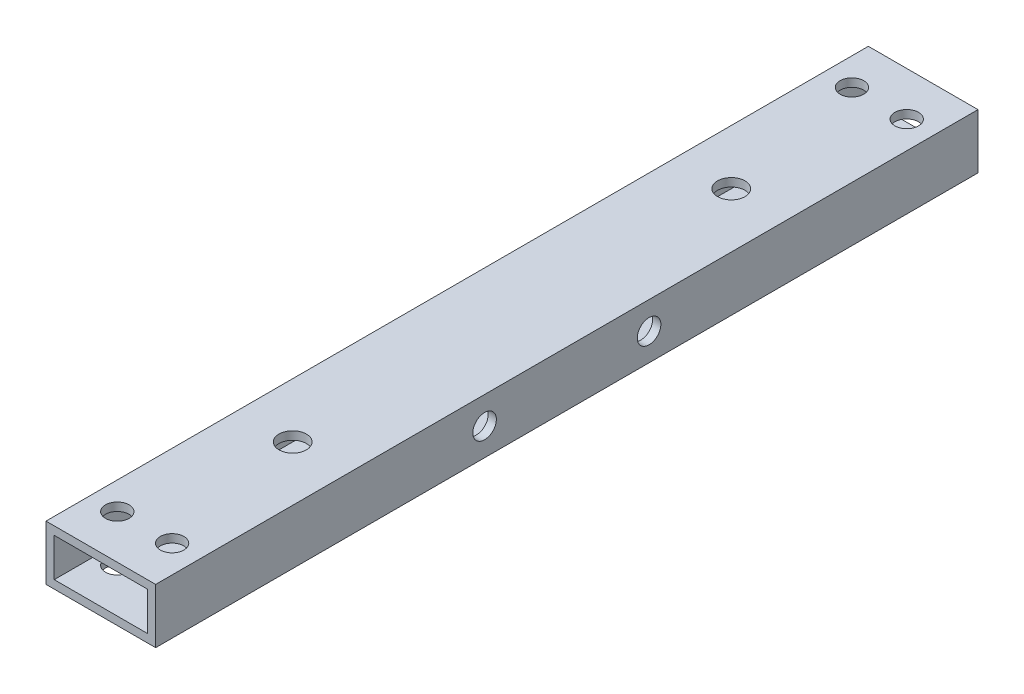
ISO-10303-21;
HEADER;
FILE_DESCRIPTION(('STEP AP214'),'2;1');
FILE_NAME('part.step','',(''),(''),'','','');
FILE_SCHEMA(('AUTOMOTIVE_DESIGN { 1 0 10303 214 1 1 1 1 }'));
ENDSEC;
DATA;
#1=APPLICATION_CONTEXT('core data for automotive mechanical design processes');
#2=APPLICATION_PROTOCOL_DEFINITION('international standard','automotive_design',2000,#1);
#3=PRODUCT_CONTEXT('',#1,'mechanical');
#4=PRODUCT('Part','Part','',(#3));
#5=PRODUCT_RELATED_PRODUCT_CATEGORY('part','',(#4));
#6=PRODUCT_DEFINITION_FORMATION('','',#4);
#7=PRODUCT_DEFINITION_CONTEXT('part definition',#1,'design');
#8=PRODUCT_DEFINITION('design','',#6,#7);
#9=PRODUCT_DEFINITION_SHAPE('','',#8);
#10=(LENGTH_UNIT() NAMED_UNIT(*) SI_UNIT(.MILLI.,.METRE.));
#11=(NAMED_UNIT(*) PLANE_ANGLE_UNIT() SI_UNIT($,.RADIAN.));
#12=(NAMED_UNIT(*) SI_UNIT($,.STERADIAN.) SOLID_ANGLE_UNIT());
#13=UNCERTAINTY_MEASURE_WITH_UNIT(LENGTH_MEASURE(1.E-05),#10,'distance_accuracy_value','');
#14=(GEOMETRIC_REPRESENTATION_CONTEXT(3) GLOBAL_UNCERTAINTY_ASSIGNED_CONTEXT((#13)) GLOBAL_UNIT_ASSIGNED_CONTEXT((#10,
#11,#12)) REPRESENTATION_CONTEXT('',''));
#15=CARTESIAN_POINT('',(0.,0.,0.));
#16=DIRECTION('',(0.,0.,1.));
#17=DIRECTION('',(1.,0.,0.));
#18=AXIS2_PLACEMENT_3D('',#15,#16,#17);
#19=CARTESIAN_POINT('',(0.,0.,150.));
#20=DIRECTION('',(0.,0.,1.));
#21=DIRECTION('',(1.,0.,0.));
#22=AXIS2_PLACEMENT_3D('',#19,#20,#21);
#23=PLANE('',#22);
#24=DIRECTION('',(0.,1.,0.));
#25=VECTOR('',#24,1.);
#26=CARTESIAN_POINT('',(10.,5.,150.));
#27=LINE('',#26,#25);
#28=CARTESIAN_POINT('',(10.,-5.,150.));
#29=VERTEX_POINT('',#28);
#30=CARTESIAN_POINT('',(10.,5.,150.));
#31=VERTEX_POINT('',#30);
#32=EDGE_CURVE('E164',#29,#31,#27,.T.);
#33=ORIENTED_EDGE('',*,*,#32,.T.);
#34=DIRECTION('',(-1.,0.,0.));
#35=VECTOR('',#34,1.);
#36=CARTESIAN_POINT('',(-10.,5.,150.));
#37=LINE('',#36,#35);
#38=CARTESIAN_POINT('',(-10.,5.,150.));
#39=VERTEX_POINT('',#38);
#40=EDGE_CURVE('E167',#31,#39,#37,.T.);
#41=ORIENTED_EDGE('',*,*,#40,.T.);
#42=DIRECTION('',(0.,-1.,0.));
#43=VECTOR('',#42,1.);
#44=CARTESIAN_POINT('',(-10.,5.,150.));
#45=LINE('',#44,#43);
#46=CARTESIAN_POINT('',(-10.,-5.,150.));
#47=VERTEX_POINT('',#46);
#48=EDGE_CURVE('E170',#39,#47,#45,.T.);
#49=ORIENTED_EDGE('',*,*,#48,.T.);
#50=DIRECTION('',(1.,0.,0.));
#51=VECTOR('',#50,1.);
#52=CARTESIAN_POINT('',(-10.,-5.,150.));
#53=LINE('',#52,#51);
#54=EDGE_CURVE('E172',#47,#29,#53,.T.);
#55=ORIENTED_EDGE('',*,*,#54,.T.);
#56=EDGE_LOOP('',(#33,#41,#49,#55));
#57=FACE_BOUND('',#56,.T.);
#58=DIRECTION('',(-1.,0.,0.));
#59=VECTOR('',#58,1.);
#60=CARTESIAN_POINT('',(-10.,3.5,150.));
#61=LINE('',#60,#59);
#62=CARTESIAN_POINT('',(8.5,3.5,150.));
#63=VERTEX_POINT('',#62);
#64=CARTESIAN_POINT('',(-8.5,3.5,150.));
#65=VERTEX_POINT('',#64);
#66=EDGE_CURVE('E134',#63,#65,#61,.T.);
#67=ORIENTED_EDGE('',*,*,#66,.F.);
#68=DIRECTION('',(0.,1.,0.));
#69=VECTOR('',#68,1.);
#70=CARTESIAN_POINT('',(8.5,5.,150.));
#71=LINE('',#70,#69);
#72=CARTESIAN_POINT('',(8.5,-3.5,150.));
#73=VERTEX_POINT('',#72);
#74=EDGE_CURVE('E126',#73,#63,#71,.T.);
#75=ORIENTED_EDGE('',*,*,#74,.F.);
#76=DIRECTION('',(1.,0.,0.));
#77=VECTOR('',#76,1.);
#78=CARTESIAN_POINT('',(-10.,-3.5,150.));
#79=LINE('',#78,#77);
#80=CARTESIAN_POINT('',(-8.5,-3.5,150.));
#81=VERTEX_POINT('',#80);
#82=EDGE_CURVE('E148',#81,#73,#79,.T.);
#83=ORIENTED_EDGE('',*,*,#82,.F.);
#84=DIRECTION('',(0.,-1.,0.));
#85=VECTOR('',#84,1.);
#86=CARTESIAN_POINT('',(-8.5,5.,150.));
#87=LINE('',#86,#85);
#88=EDGE_CURVE('E146',#65,#81,#87,.T.);
#89=ORIENTED_EDGE('',*,*,#88,.F.);
#90=EDGE_LOOP('',(#67,#75,#83,#89));
#91=FACE_BOUND('',#90,.T.);
#92=ADVANCED_FACE('F59',(#57,#91),#23,.T.);
#93=CARTESIAN_POINT('',(0.,0.,0.));
#94=DIRECTION('',(0.,0.,1.));
#95=DIRECTION('',(1.,0.,0.));
#96=AXIS2_PLACEMENT_3D('',#93,#94,#95);
#97=PLANE('',#96);
#98=DIRECTION('',(0.,1.,0.));
#99=VECTOR('',#98,1.);
#100=CARTESIAN_POINT('',(10.,5.,0.));
#101=LINE('',#100,#99);
#102=CARTESIAN_POINT('',(10.,-5.,0.));
#103=VERTEX_POINT('',#102);
#104=CARTESIAN_POINT('',(10.,5.,0.));
#105=VERTEX_POINT('',#104);
#106=EDGE_CURVE('E142',#103,#105,#101,.T.);
#107=ORIENTED_EDGE('',*,*,#106,.F.);
#108=DIRECTION('',(1.,0.,0.));
#109=VECTOR('',#108,1.);
#110=CARTESIAN_POINT('',(-10.,-5.,0.));
#111=LINE('',#110,#109);
#112=CARTESIAN_POINT('',(-10.,-5.,0.));
#113=VERTEX_POINT('',#112);
#114=EDGE_CURVE('E168',#113,#103,#111,.T.);
#115=ORIENTED_EDGE('',*,*,#114,.F.);
#116=DIRECTION('',(0.,-1.,0.));
#117=VECTOR('',#116,1.);
#118=CARTESIAN_POINT('',(-10.,5.,0.));
#119=LINE('',#118,#117);
#120=CARTESIAN_POINT('',(-10.,5.,0.));
#121=VERTEX_POINT('',#120);
#122=EDGE_CURVE('E179',#121,#113,#119,.T.);
#123=ORIENTED_EDGE('',*,*,#122,.F.);
#124=DIRECTION('',(-1.,0.,0.));
#125=VECTOR('',#124,1.);
#126=CARTESIAN_POINT('',(-10.,5.,0.));
#127=LINE('',#126,#125);
#128=EDGE_CURVE('E177',#105,#121,#127,.T.);
#129=ORIENTED_EDGE('',*,*,#128,.F.);
#130=EDGE_LOOP('',(#107,#115,#123,#129));
#131=FACE_BOUND('',#130,.T.);
#132=DIRECTION('',(0.,1.,0.));
#133=VECTOR('',#132,1.);
#134=CARTESIAN_POINT('',(8.5,5.,0.));
#135=LINE('',#134,#133);
#136=CARTESIAN_POINT('',(8.5,-3.5,0.));
#137=VERTEX_POINT('',#136);
#138=CARTESIAN_POINT('',(8.5,3.5,0.));
#139=VERTEX_POINT('',#138);
#140=EDGE_CURVE('E84',#137,#139,#135,.T.);
#141=ORIENTED_EDGE('',*,*,#140,.T.);
#142=DIRECTION('',(-1.,0.,0.));
#143=VECTOR('',#142,1.);
#144=CARTESIAN_POINT('',(-10.,3.5,0.));
#145=LINE('',#144,#143);
#146=CARTESIAN_POINT('',(-8.5,3.5,0.));
#147=VERTEX_POINT('',#146);
#148=EDGE_CURVE('E141',#139,#147,#145,.T.);
#149=ORIENTED_EDGE('',*,*,#148,.T.);
#150=DIRECTION('',(0.,-1.,0.));
#151=VECTOR('',#150,1.);
#152=CARTESIAN_POINT('',(-8.5,5.,0.));
#153=LINE('',#152,#151);
#154=CARTESIAN_POINT('',(-8.5,-3.5,0.));
#155=VERTEX_POINT('',#154);
#156=EDGE_CURVE('E156',#147,#155,#153,.T.);
#157=ORIENTED_EDGE('',*,*,#156,.T.);
#158=DIRECTION('',(1.,0.,0.));
#159=VECTOR('',#158,1.);
#160=CARTESIAN_POINT('',(-10.,-3.5,0.));
#161=LINE('',#160,#159);
#162=EDGE_CURVE('E135',#155,#137,#161,.T.);
#163=ORIENTED_EDGE('',*,*,#162,.T.);
#164=EDGE_LOOP('',(#141,#149,#157,#163));
#165=FACE_BOUND('',#164,.T.);
#166=ADVANCED_FACE('F324',(#131,#165),#97,.F.);
#167=CARTESIAN_POINT('',(10.,5.,150.));
#168=DIRECTION('',(-1.,0.,0.));
#169=DIRECTION('',(0.,-1.,0.));
#170=AXIS2_PLACEMENT_3D('',#167,#168,#169);
#171=PLANE('',#170);
#172=CARTESIAN_POINT('',(10.,0.,60.));
#173=DIRECTION('',(1.,0.,0.));
#174=DIRECTION('',(0.,0.,-1.));
#175=AXIS2_PLACEMENT_3D('',#172,#173,#174);
#176=CIRCLE('',#175,2.15);
#177=CARTESIAN_POINT('',(10.,0.,57.85));
#178=VERTEX_POINT('',#177);
#179=EDGE_CURVE('E221',#178,#178,#176,.T.);
#180=ORIENTED_EDGE('',*,*,#179,.F.);
#181=EDGE_LOOP('',(#180));
#182=FACE_BOUND('',#181,.T.);
#183=CARTESIAN_POINT('',(10.,0.,90.));
#184=DIRECTION('',(1.,0.,0.));
#185=DIRECTION('',(0.,0.,1.));
#186=AXIS2_PLACEMENT_3D('',#183,#184,#185);
#187=CIRCLE('',#186,2.15000000000002);
#188=CARTESIAN_POINT('',(10.,0.,92.15));
#189=VERTEX_POINT('',#188);
#190=EDGE_CURVE('E231',#189,#189,#187,.T.);
#191=ORIENTED_EDGE('',*,*,#190,.F.);
#192=EDGE_LOOP('',(#191));
#193=FACE_BOUND('',#192,.T.);
#194=ORIENTED_EDGE('',*,*,#106,.T.);
#195=DIRECTION('',(0.,0.,-1.));
#196=VECTOR('',#195,1.);
#197=CARTESIAN_POINT('',(10.,5.,150.));
#198=LINE('',#197,#196);
#199=EDGE_CURVE('E12',#31,#105,#198,.T.);
#200=ORIENTED_EDGE('',*,*,#199,.F.);
#201=ORIENTED_EDGE('',*,*,#32,.F.);
#202=DIRECTION('',(0.,0.,-1.));
#203=VECTOR('',#202,1.);
#204=CARTESIAN_POINT('',(10.,-5.,150.));
#205=LINE('',#204,#203);
#206=EDGE_CURVE('E174',#29,#103,#205,.T.);
#207=ORIENTED_EDGE('',*,*,#206,.T.);
#208=EDGE_LOOP('',(#194,#200,#201,#207));
#209=FACE_BOUND('',#208,.T.);
#210=ADVANCED_FACE('F61',(#182,#193,#209),#171,.F.);
#211=CARTESIAN_POINT('',(-10.,5.,150.));
#212=DIRECTION('',(0.,-1.,0.));
#213=DIRECTION('',(0.,0.,-1.));
#214=AXIS2_PLACEMENT_3D('',#211,#212,#213);
#215=PLANE('',#214);
#216=CARTESIAN_POINT('',(0.,5.,35.));
#217=DIRECTION('',(0.,1.,0.));
#218=DIRECTION('',(0.,0.,1.));
#219=AXIS2_PLACEMENT_3D('',#216,#217,#218);
#220=CIRCLE('',#219,2.5);
#221=CARTESIAN_POINT('',(0.,5.,37.5));
#222=VERTEX_POINT('',#221);
#223=EDGE_CURVE('E241',#222,#222,#220,.T.);
#224=ORIENTED_EDGE('',*,*,#223,.F.);
#225=EDGE_LOOP('',(#224));
#226=FACE_BOUND('',#225,.T.);
#227=CARTESIAN_POINT('',(-5.,5.,8.00000000000001));
#228=DIRECTION('',(0.,1.,0.));
#229=DIRECTION('',(0.,0.,1.));
#230=AXIS2_PLACEMENT_3D('',#227,#228,#229);
#231=CIRCLE('',#230,2.15000000000001);
#232=CARTESIAN_POINT('',(-5.,5.,10.15));
#233=VERTEX_POINT('',#232);
#234=EDGE_CURVE('E248',#233,#233,#231,.T.);
#235=ORIENTED_EDGE('',*,*,#234,.F.);
#236=EDGE_LOOP('',(#235));
#237=FACE_BOUND('',#236,.T.);
#238=CARTESIAN_POINT('',(5.,5.,8.00000000000001));
#239=DIRECTION('',(0.,1.,0.));
#240=DIRECTION('',(0.,0.,-1.));
#241=AXIS2_PLACEMENT_3D('',#238,#239,#240);
#242=CIRCLE('',#241,2.15000000000001);
#243=CARTESIAN_POINT('',(5.,5.,5.85));
#244=VERTEX_POINT('',#243);
#245=EDGE_CURVE('E247',#244,#244,#242,.T.);
#246=ORIENTED_EDGE('',*,*,#245,.F.);
#247=EDGE_LOOP('',(#246));
#248=FACE_BOUND('',#247,.T.);
#249=CARTESIAN_POINT('',(-5.,5.,142.));
#250=DIRECTION('',(0.,1.,0.));
#251=DIRECTION('',(0.,0.,-1.));
#252=AXIS2_PLACEMENT_3D('',#249,#250,#251);
#253=CIRCLE('',#252,2.15000000000002);
#254=CARTESIAN_POINT('',(-5.,5.,139.85));
#255=VERTEX_POINT('',#254);
#256=EDGE_CURVE('E260',#255,#255,#253,.T.);
#257=ORIENTED_EDGE('',*,*,#256,.F.);
#258=EDGE_LOOP('',(#257));
#259=FACE_BOUND('',#258,.T.);
#260=CARTESIAN_POINT('',(0.,5.,115.));
#261=DIRECTION('',(0.,1.,0.));
#262=DIRECTION('',(0.,0.,-1.));
#263=AXIS2_PLACEMENT_3D('',#260,#261,#262);
#264=CIRCLE('',#263,2.5);
#265=CARTESIAN_POINT('',(0.,5.,112.5));
#266=VERTEX_POINT('',#265);
#267=EDGE_CURVE('E237',#266,#266,#264,.T.);
#268=ORIENTED_EDGE('',*,*,#267,.F.);
#269=EDGE_LOOP('',(#268));
#270=FACE_BOUND('',#269,.T.);
#271=CARTESIAN_POINT('',(5.,5.,142.));
#272=DIRECTION('',(0.,1.,0.));
#273=DIRECTION('',(0.,0.,1.));
#274=AXIS2_PLACEMENT_3D('',#271,#272,#273);
#275=CIRCLE('',#274,2.15000000000002);
#276=CARTESIAN_POINT('',(5.,5.,144.15));
#277=VERTEX_POINT('',#276);
#278=EDGE_CURVE('E259',#277,#277,#275,.T.);
#279=ORIENTED_EDGE('',*,*,#278,.F.);
#280=EDGE_LOOP('',(#279));
#281=FACE_BOUND('',#280,.T.);
#282=ORIENTED_EDGE('',*,*,#128,.T.);
#283=DIRECTION('',(0.,0.,-1.));
#284=VECTOR('',#283,1.);
#285=CARTESIAN_POINT('',(-10.,5.,150.));
#286=LINE('',#285,#284);
#287=EDGE_CURVE('E68',#39,#121,#286,.T.);
#288=ORIENTED_EDGE('',*,*,#287,.F.);
#289=ORIENTED_EDGE('',*,*,#40,.F.);
#290=ORIENTED_EDGE('',*,*,#199,.T.);
#291=EDGE_LOOP('',(#282,#288,#289,#290));
#292=FACE_BOUND('',#291,.T.);
#293=ADVANCED_FACE('F310',(#226,#237,#248,#259,#270,#281,#292),#215,.F.);
#294=CARTESIAN_POINT('',(-10.,5.,150.));
#295=DIRECTION('',(1.,0.,0.));
#296=DIRECTION('',(0.,1.,0.));
#297=AXIS2_PLACEMENT_3D('',#294,#295,#296);
#298=PLANE('',#297);
#299=CARTESIAN_POINT('',(-10.,0.,60.));
#300=DIRECTION('',(1.,0.,0.));
#301=DIRECTION('',(0.,0.,-1.));
#302=AXIS2_PLACEMENT_3D('',#299,#300,#301);
#303=CIRCLE('',#302,2.15);
#304=CARTESIAN_POINT('',(-10.,0.,57.85));
#305=VERTEX_POINT('',#304);
#306=EDGE_CURVE('E215',#305,#305,#303,.T.);
#307=ORIENTED_EDGE('',*,*,#306,.T.);
#308=EDGE_LOOP('',(#307));
#309=FACE_BOUND('',#308,.T.);
#310=CARTESIAN_POINT('',(-10.,0.,90.));
#311=DIRECTION('',(1.,0.,0.));
#312=DIRECTION('',(0.,0.,1.));
#313=AXIS2_PLACEMENT_3D('',#310,#311,#312);
#314=CIRCLE('',#313,2.15000000000002);
#315=CARTESIAN_POINT('',(-10.,0.,92.15));
#316=VERTEX_POINT('',#315);
#317=EDGE_CURVE('E226',#316,#316,#314,.T.);
#318=ORIENTED_EDGE('',*,*,#317,.T.);
#319=EDGE_LOOP('',(#318));
#320=FACE_BOUND('',#319,.T.);
#321=ORIENTED_EDGE('',*,*,#122,.T.);
#322=DIRECTION('',(0.,0.,-1.));
#323=VECTOR('',#322,1.);
#324=CARTESIAN_POINT('',(-10.,-5.,150.));
#325=LINE('',#324,#323);
#326=EDGE_CURVE('E184',#47,#113,#325,.T.);
#327=ORIENTED_EDGE('',*,*,#326,.F.);
#328=ORIENTED_EDGE('',*,*,#48,.F.);
#329=ORIENTED_EDGE('',*,*,#287,.T.);
#330=EDGE_LOOP('',(#321,#327,#328,#329));
#331=FACE_BOUND('',#330,.T.);
#332=ADVANCED_FACE('F313',(#309,#320,#331),#298,.F.);
#333=CARTESIAN_POINT('',(-10.,-5.,150.));
#334=DIRECTION('',(0.,1.,0.));
#335=DIRECTION('',(0.,0.,1.));
#336=AXIS2_PLACEMENT_3D('',#333,#334,#335);
#337=PLANE('',#336);
#338=CARTESIAN_POINT('',(0.,-5.,35.));
#339=DIRECTION('',(0.,1.,0.));
#340=DIRECTION('',(0.,0.,1.));
#341=AXIS2_PLACEMENT_3D('',#338,#339,#340);
#342=CIRCLE('',#341,2.5);
#343=CARTESIAN_POINT('',(0.,-5.,37.5));
#344=VERTEX_POINT('',#343);
#345=EDGE_CURVE('E251',#344,#344,#342,.T.);
#346=ORIENTED_EDGE('',*,*,#345,.T.);
#347=EDGE_LOOP('',(#346));
#348=FACE_BOUND('',#347,.T.);
#349=CARTESIAN_POINT('',(-5.,-5.,8.00000000000001));
#350=DIRECTION('',(0.,1.,0.));
#351=DIRECTION('',(0.,0.,1.));
#352=AXIS2_PLACEMENT_3D('',#349,#350,#351);
#353=CIRCLE('',#352,2.15000000000001);
#354=CARTESIAN_POINT('',(-5.,-5.,10.15));
#355=VERTEX_POINT('',#354);
#356=EDGE_CURVE('E244',#355,#355,#353,.T.);
#357=ORIENTED_EDGE('',*,*,#356,.T.);
#358=EDGE_LOOP('',(#357));
#359=FACE_BOUND('',#358,.T.);
#360=CARTESIAN_POINT('',(5.,-5.,8.00000000000001));
#361=DIRECTION('',(0.,1.,0.));
#362=DIRECTION('',(0.,0.,-1.));
#363=AXIS2_PLACEMENT_3D('',#360,#361,#362);
#364=CIRCLE('',#363,2.15000000000001);
#365=CARTESIAN_POINT('',(5.,-5.,5.85));
#366=VERTEX_POINT('',#365);
#367=EDGE_CURVE('E263',#366,#366,#364,.T.);
#368=ORIENTED_EDGE('',*,*,#367,.T.);
#369=EDGE_LOOP('',(#368));
#370=FACE_BOUND('',#369,.T.);
#371=CARTESIAN_POINT('',(-5.,-5.,142.));
#372=DIRECTION('',(0.,1.,0.));
#373=DIRECTION('',(0.,0.,-1.));
#374=AXIS2_PLACEMENT_3D('',#371,#372,#373);
#375=CIRCLE('',#374,2.15000000000002);
#376=CARTESIAN_POINT('',(-5.,-5.,139.85));
#377=VERTEX_POINT('',#376);
#378=EDGE_CURVE('E256',#377,#377,#375,.T.);
#379=ORIENTED_EDGE('',*,*,#378,.T.);
#380=EDGE_LOOP('',(#379));
#381=FACE_BOUND('',#380,.T.);
#382=CARTESIAN_POINT('',(0.,-5.,115.));
#383=DIRECTION('',(0.,1.,0.));
#384=DIRECTION('',(0.,0.,-1.));
#385=AXIS2_PLACEMENT_3D('',#382,#383,#384);
#386=CIRCLE('',#385,2.5);
#387=CARTESIAN_POINT('',(0.,-5.,112.5));
#388=VERTEX_POINT('',#387);
#389=EDGE_CURVE('E238',#388,#388,#386,.T.);
#390=ORIENTED_EDGE('',*,*,#389,.T.);
#391=EDGE_LOOP('',(#390));
#392=FACE_BOUND('',#391,.T.);
#393=CARTESIAN_POINT('',(5.,-5.,142.));
#394=DIRECTION('',(0.,1.,0.));
#395=DIRECTION('',(0.,0.,1.));
#396=AXIS2_PLACEMENT_3D('',#393,#394,#395);
#397=CIRCLE('',#396,2.15000000000002);
#398=CARTESIAN_POINT('',(5.,-5.,144.15));
#399=VERTEX_POINT('',#398);
#400=EDGE_CURVE('E193',#399,#399,#397,.T.);
#401=ORIENTED_EDGE('',*,*,#400,.T.);
#402=EDGE_LOOP('',(#401));
#403=FACE_BOUND('',#402,.T.);
#404=ORIENTED_EDGE('',*,*,#114,.T.);
#405=ORIENTED_EDGE('',*,*,#206,.F.);
#406=ORIENTED_EDGE('',*,*,#54,.F.);
#407=ORIENTED_EDGE('',*,*,#326,.T.);
#408=EDGE_LOOP('',(#404,#405,#406,#407));
#409=FACE_BOUND('',#408,.T.);
#410=ADVANCED_FACE('F328',(#348,#359,#370,#381,#392,#403,#409),#337,.F.);
#411=CARTESIAN_POINT('',(8.5,5.,150.));
#412=DIRECTION('',(-1.,0.,0.));
#413=DIRECTION('',(0.,-1.,0.));
#414=AXIS2_PLACEMENT_3D('',#411,#412,#413);
#415=PLANE('',#414);
#416=CARTESIAN_POINT('',(8.5,0.,60.));
#417=DIRECTION('',(-1.,0.,0.));
#418=DIRECTION('',(0.,-1.,0.));
#419=AXIS2_PLACEMENT_3D('',#416,#417,#418);
#420=CIRCLE('',#419,2.15);
#421=CARTESIAN_POINT('',(8.5,-2.15,60.));
#422=VERTEX_POINT('',#421);
#423=EDGE_CURVE('E234',#422,#422,#420,.T.);
#424=ORIENTED_EDGE('',*,*,#423,.F.);
#425=EDGE_LOOP('',(#424));
#426=FACE_BOUND('',#425,.T.);
#427=CARTESIAN_POINT('',(8.5,0.,90.));
#428=DIRECTION('',(-1.,0.,0.));
#429=DIRECTION('',(0.,-1.,0.));
#430=AXIS2_PLACEMENT_3D('',#427,#428,#429);
#431=CIRCLE('',#430,2.15000000000002);
#432=CARTESIAN_POINT('',(8.5,-2.15000000000002,90.));
#433=VERTEX_POINT('',#432);
#434=EDGE_CURVE('E214',#433,#433,#431,.T.);
#435=ORIENTED_EDGE('',*,*,#434,.F.);
#436=EDGE_LOOP('',(#435));
#437=FACE_BOUND('',#436,.T.);
#438=ORIENTED_EDGE('',*,*,#140,.F.);
#439=DIRECTION('',(0.,0.,-1.));
#440=VECTOR('',#439,1.);
#441=CARTESIAN_POINT('',(8.5,-3.5,150.));
#442=LINE('',#441,#440);
#443=EDGE_CURVE('E130',#73,#137,#442,.T.);
#444=ORIENTED_EDGE('',*,*,#443,.F.);
#445=ORIENTED_EDGE('',*,*,#74,.T.);
#446=DIRECTION('',(0.,0.,-1.));
#447=VECTOR('',#446,1.);
#448=CARTESIAN_POINT('',(8.5,3.5,150.));
#449=LINE('',#448,#447);
#450=EDGE_CURVE('E129',#63,#139,#449,.T.);
#451=ORIENTED_EDGE('',*,*,#450,.T.);
#452=EDGE_LOOP('',(#438,#444,#445,#451));
#453=FACE_BOUND('',#452,.T.);
#454=ADVANCED_FACE('F128',(#426,#437,#453),#415,.T.);
#455=CARTESIAN_POINT('',(-10.,3.5,150.));
#456=DIRECTION('',(0.,-1.,0.));
#457=DIRECTION('',(0.,0.,-1.));
#458=AXIS2_PLACEMENT_3D('',#455,#456,#457);
#459=PLANE('',#458);
#460=CARTESIAN_POINT('',(0.,3.5,35.));
#461=DIRECTION('',(0.,-1.,0.));
#462=DIRECTION('',(0.,0.,-1.));
#463=AXIS2_PLACEMENT_3D('',#460,#461,#462);
#464=CIRCLE('',#463,2.5);
#465=CARTESIAN_POINT('',(0.,3.5,32.5));
#466=VERTEX_POINT('',#465);
#467=EDGE_CURVE('E154',#466,#466,#464,.T.);
#468=ORIENTED_EDGE('',*,*,#467,.F.);
#469=EDGE_LOOP('',(#468));
#470=FACE_BOUND('',#469,.T.);
#471=CARTESIAN_POINT('',(-5.,3.5,8.00000000000001));
#472=DIRECTION('',(0.,-1.,0.));
#473=DIRECTION('',(0.,0.,-1.));
#474=AXIS2_PLACEMENT_3D('',#471,#472,#473);
#475=CIRCLE('',#474,2.15000000000001);
#476=CARTESIAN_POINT('',(-5.,3.5,5.85));
#477=VERTEX_POINT('',#476);
#478=EDGE_CURVE('E209',#477,#477,#475,.T.);
#479=ORIENTED_EDGE('',*,*,#478,.F.);
#480=EDGE_LOOP('',(#479));
#481=FACE_BOUND('',#480,.T.);
#482=CARTESIAN_POINT('',(5.,3.5,8.00000000000001));
#483=DIRECTION('',(0.,-1.,0.));
#484=DIRECTION('',(0.,0.,-1.));
#485=AXIS2_PLACEMENT_3D('',#482,#483,#484);
#486=CIRCLE('',#485,2.15000000000001);
#487=CARTESIAN_POINT('',(5.,3.5,5.85));
#488=VERTEX_POINT('',#487);
#489=EDGE_CURVE('E205',#488,#488,#486,.T.);
#490=ORIENTED_EDGE('',*,*,#489,.F.);
#491=EDGE_LOOP('',(#490));
#492=FACE_BOUND('',#491,.T.);
#493=CARTESIAN_POINT('',(-5.,3.5,142.));
#494=DIRECTION('',(0.,-1.,0.));
#495=DIRECTION('',(0.,0.,-1.));
#496=AXIS2_PLACEMENT_3D('',#493,#494,#495);
#497=CIRCLE('',#496,2.15000000000002);
#498=CARTESIAN_POINT('',(-5.,3.5,139.85));
#499=VERTEX_POINT('',#498);
#500=EDGE_CURVE('E201',#499,#499,#497,.T.);
#501=ORIENTED_EDGE('',*,*,#500,.F.);
#502=EDGE_LOOP('',(#501));
#503=FACE_BOUND('',#502,.T.);
#504=CARTESIAN_POINT('',(0.,3.5,115.));
#505=DIRECTION('',(0.,-1.,0.));
#506=DIRECTION('',(0.,0.,-1.));
#507=AXIS2_PLACEMENT_3D('',#504,#505,#506);
#508=CIRCLE('',#507,2.5);
#509=CARTESIAN_POINT('',(0.,3.5,112.5));
#510=VERTEX_POINT('',#509);
#511=EDGE_CURVE('E197',#510,#510,#508,.T.);
#512=ORIENTED_EDGE('',*,*,#511,.F.);
#513=EDGE_LOOP('',(#512));
#514=FACE_BOUND('',#513,.T.);
#515=CARTESIAN_POINT('',(5.,3.5,142.));
#516=DIRECTION('',(0.,-1.,0.));
#517=DIRECTION('',(0.,0.,-1.));
#518=AXIS2_PLACEMENT_3D('',#515,#516,#517);
#519=CIRCLE('',#518,2.15000000000002);
#520=CARTESIAN_POINT('',(5.,3.5,139.85));
#521=VERTEX_POINT('',#520);
#522=EDGE_CURVE('E192',#521,#521,#519,.T.);
#523=ORIENTED_EDGE('',*,*,#522,.F.);
#524=EDGE_LOOP('',(#523));
#525=FACE_BOUND('',#524,.T.);
#526=ORIENTED_EDGE('',*,*,#148,.F.);
#527=ORIENTED_EDGE('',*,*,#450,.F.);
#528=ORIENTED_EDGE('',*,*,#66,.T.);
#529=DIRECTION('',(0.,0.,-1.));
#530=VECTOR('',#529,1.);
#531=CARTESIAN_POINT('',(-8.5,3.5,150.));
#532=LINE('',#531,#530);
#533=EDGE_CURVE('E143',#65,#147,#532,.T.);
#534=ORIENTED_EDGE('',*,*,#533,.T.);
#535=EDGE_LOOP('',(#526,#527,#528,#534));
#536=FACE_BOUND('',#535,.T.);
#537=ADVANCED_FACE('F138',(#470,#481,#492,#503,#514,#525,#536),#459,.T.);
#538=CARTESIAN_POINT('',(-8.5,5.,150.));
#539=DIRECTION('',(1.,0.,0.));
#540=DIRECTION('',(0.,1.,0.));
#541=AXIS2_PLACEMENT_3D('',#538,#539,#540);
#542=PLANE('',#541);
#543=CARTESIAN_POINT('',(-8.5,0.,60.));
#544=DIRECTION('',(1.,0.,0.));
#545=DIRECTION('',(0.,1.,0.));
#546=AXIS2_PLACEMENT_3D('',#543,#544,#545);
#547=CIRCLE('',#546,2.15);
#548=CARTESIAN_POINT('',(-8.5,2.15,60.));
#549=VERTEX_POINT('',#548);
#550=EDGE_CURVE('E63',#549,#549,#547,.T.);
#551=ORIENTED_EDGE('',*,*,#550,.F.);
#552=EDGE_LOOP('',(#551));
#553=FACE_BOUND('',#552,.T.);
#554=CARTESIAN_POINT('',(-8.5,0.,90.));
#555=DIRECTION('',(1.,0.,0.));
#556=DIRECTION('',(0.,1.,0.));
#557=AXIS2_PLACEMENT_3D('',#554,#555,#556);
#558=CIRCLE('',#557,2.15000000000002);
#559=CARTESIAN_POINT('',(-8.5,2.15000000000001,90.));
#560=VERTEX_POINT('',#559);
#561=EDGE_CURVE('E212',#560,#560,#558,.T.);
#562=ORIENTED_EDGE('',*,*,#561,.F.);
#563=EDGE_LOOP('',(#562));
#564=FACE_BOUND('',#563,.T.);
#565=ORIENTED_EDGE('',*,*,#156,.F.);
#566=ORIENTED_EDGE('',*,*,#533,.F.);
#567=ORIENTED_EDGE('',*,*,#88,.T.);
#568=DIRECTION('',(0.,0.,-1.));
#569=VECTOR('',#568,1.);
#570=CARTESIAN_POINT('',(-8.5,-3.5,150.));
#571=LINE('',#570,#569);
#572=EDGE_CURVE('E76',#81,#155,#571,.T.);
#573=ORIENTED_EDGE('',*,*,#572,.T.);
#574=EDGE_LOOP('',(#565,#566,#567,#573));
#575=FACE_BOUND('',#574,.T.);
#576=ADVANCED_FACE('F289',(#553,#564,#575),#542,.T.);
#577=CARTESIAN_POINT('',(-10.,-3.5,150.));
#578=DIRECTION('',(0.,1.,0.));
#579=DIRECTION('',(0.,0.,1.));
#580=AXIS2_PLACEMENT_3D('',#577,#578,#579);
#581=PLANE('',#580);
#582=CARTESIAN_POINT('',(0.,-3.5,35.));
#583=DIRECTION('',(0.,1.,0.));
#584=DIRECTION('',(0.,0.,1.));
#585=AXIS2_PLACEMENT_3D('',#582,#583,#584);
#586=CIRCLE('',#585,2.5);
#587=CARTESIAN_POINT('',(0.,-3.5,37.5));
#588=VERTEX_POINT('',#587);
#589=EDGE_CURVE('E210',#588,#588,#586,.T.);
#590=ORIENTED_EDGE('',*,*,#589,.F.);
#591=EDGE_LOOP('',(#590));
#592=FACE_BOUND('',#591,.T.);
#593=CARTESIAN_POINT('',(-5.,-3.5,8.00000000000001));
#594=DIRECTION('',(0.,1.,0.));
#595=DIRECTION('',(0.,0.,1.));
#596=AXIS2_PLACEMENT_3D('',#593,#594,#595);
#597=CIRCLE('',#596,2.15000000000001);
#598=CARTESIAN_POINT('',(-5.,-3.5,10.15));
#599=VERTEX_POINT('',#598);
#600=EDGE_CURVE('E206',#599,#599,#597,.T.);
#601=ORIENTED_EDGE('',*,*,#600,.F.);
#602=EDGE_LOOP('',(#601));
#603=FACE_BOUND('',#602,.T.);
#604=CARTESIAN_POINT('',(5.,-3.5,8.00000000000001));
#605=DIRECTION('',(0.,1.,0.));
#606=DIRECTION('',(0.,0.,1.));
#607=AXIS2_PLACEMENT_3D('',#604,#605,#606);
#608=CIRCLE('',#607,2.15000000000001);
#609=CARTESIAN_POINT('',(5.,-3.5,10.15));
#610=VERTEX_POINT('',#609);
#611=EDGE_CURVE('E202',#610,#610,#608,.T.);
#612=ORIENTED_EDGE('',*,*,#611,.F.);
#613=EDGE_LOOP('',(#612));
#614=FACE_BOUND('',#613,.T.);
#615=CARTESIAN_POINT('',(-5.,-3.5,142.));
#616=DIRECTION('',(0.,1.,0.));
#617=DIRECTION('',(0.,0.,1.));
#618=AXIS2_PLACEMENT_3D('',#615,#616,#617);
#619=CIRCLE('',#618,2.15000000000002);
#620=CARTESIAN_POINT('',(-5.,-3.5,144.15));
#621=VERTEX_POINT('',#620);
#622=EDGE_CURVE('E198',#621,#621,#619,.T.);
#623=ORIENTED_EDGE('',*,*,#622,.F.);
#624=EDGE_LOOP('',(#623));
#625=FACE_BOUND('',#624,.T.);
#626=CARTESIAN_POINT('',(0.,-3.5,115.));
#627=DIRECTION('',(0.,1.,0.));
#628=DIRECTION('',(0.,0.,1.));
#629=AXIS2_PLACEMENT_3D('',#626,#627,#628);
#630=CIRCLE('',#629,2.5);
#631=CARTESIAN_POINT('',(0.,-3.5,117.5));
#632=VERTEX_POINT('',#631);
#633=EDGE_CURVE('E194',#632,#632,#630,.T.);
#634=ORIENTED_EDGE('',*,*,#633,.F.);
#635=EDGE_LOOP('',(#634));
#636=FACE_BOUND('',#635,.T.);
#637=CARTESIAN_POINT('',(5.,-3.5,142.));
#638=DIRECTION('',(0.,1.,0.));
#639=DIRECTION('',(0.,0.,1.));
#640=AXIS2_PLACEMENT_3D('',#637,#638,#639);
#641=CIRCLE('',#640,2.15000000000002);
#642=CARTESIAN_POINT('',(5.,-3.5,144.15));
#643=VERTEX_POINT('',#642);
#644=EDGE_CURVE('E189',#643,#643,#641,.T.);
#645=ORIENTED_EDGE('',*,*,#644,.F.);
#646=EDGE_LOOP('',(#645));
#647=FACE_BOUND('',#646,.T.);
#648=ORIENTED_EDGE('',*,*,#162,.F.);
#649=ORIENTED_EDGE('',*,*,#572,.F.);
#650=ORIENTED_EDGE('',*,*,#82,.T.);
#651=ORIENTED_EDGE('',*,*,#443,.T.);
#652=EDGE_LOOP('',(#648,#649,#650,#651));
#653=FACE_BOUND('',#652,.T.);
#654=ADVANCED_FACE('F412',(#592,#603,#614,#625,#636,#647,#653),#581,.T.);
#655=CARTESIAN_POINT('',(5.,-5.,142.));
#656=DIRECTION('',(0.,1.,0.));
#657=DIRECTION('',(0.,0.,1.));
#658=AXIS2_PLACEMENT_3D('',#655,#656,#657);
#659=CYLINDRICAL_SURFACE('',#658,2.15000000000002);
#660=ORIENTED_EDGE('',*,*,#644,.T.);
#661=EDGE_LOOP('',(#660));
#662=FACE_BOUND('',#661,.T.);
#663=ORIENTED_EDGE('',*,*,#400,.F.);
#664=EDGE_LOOP('',(#663));
#665=FACE_BOUND('',#664,.T.);
#666=ADVANCED_FACE('F307',(#662,#665),#659,.F.);
#667=CARTESIAN_POINT('',(0.,-5.,115.));
#668=DIRECTION('',(0.,1.,0.));
#669=DIRECTION('',(0.,0.,1.));
#670=AXIS2_PLACEMENT_3D('',#667,#668,#669);
#671=CYLINDRICAL_SURFACE('',#670,2.5);
#672=ORIENTED_EDGE('',*,*,#633,.T.);
#673=EDGE_LOOP('',(#672));
#674=FACE_BOUND('',#673,.T.);
#675=ORIENTED_EDGE('',*,*,#389,.F.);
#676=EDGE_LOOP('',(#675));
#677=FACE_BOUND('',#676,.T.);
#678=ADVANCED_FACE('F426',(#674,#677),#671,.F.);
#679=CARTESIAN_POINT('',(-5.,-5.,142.));
#680=DIRECTION('',(0.,1.,0.));
#681=DIRECTION('',(0.,0.,1.));
#682=AXIS2_PLACEMENT_3D('',#679,#680,#681);
#683=CYLINDRICAL_SURFACE('',#682,2.15000000000002);
#684=ORIENTED_EDGE('',*,*,#622,.T.);
#685=EDGE_LOOP('',(#684));
#686=FACE_BOUND('',#685,.T.);
#687=ORIENTED_EDGE('',*,*,#378,.F.);
#688=EDGE_LOOP('',(#687));
#689=FACE_BOUND('',#688,.T.);
#690=ADVANCED_FACE('F435',(#686,#689),#683,.F.);
#691=CARTESIAN_POINT('',(5.,-5.,8.00000000000001));
#692=DIRECTION('',(0.,1.,0.));
#693=DIRECTION('',(0.,0.,1.));
#694=AXIS2_PLACEMENT_3D('',#691,#692,#693);
#695=CYLINDRICAL_SURFACE('',#694,2.15000000000001);
#696=ORIENTED_EDGE('',*,*,#611,.T.);
#697=EDGE_LOOP('',(#696));
#698=FACE_BOUND('',#697,.T.);
#699=ORIENTED_EDGE('',*,*,#367,.F.);
#700=EDGE_LOOP('',(#699));
#701=FACE_BOUND('',#700,.T.);
#702=ADVANCED_FACE('F444',(#698,#701),#695,.F.);
#703=CARTESIAN_POINT('',(-5.,-5.,8.00000000000001));
#704=DIRECTION('',(0.,1.,0.));
#705=DIRECTION('',(0.,0.,1.));
#706=AXIS2_PLACEMENT_3D('',#703,#704,#705);
#707=CYLINDRICAL_SURFACE('',#706,2.15000000000001);
#708=ORIENTED_EDGE('',*,*,#600,.T.);
#709=EDGE_LOOP('',(#708));
#710=FACE_BOUND('',#709,.T.);
#711=ORIENTED_EDGE('',*,*,#356,.F.);
#712=EDGE_LOOP('',(#711));
#713=FACE_BOUND('',#712,.T.);
#714=ADVANCED_FACE('F455',(#710,#713),#707,.F.);
#715=CARTESIAN_POINT('',(0.,-5.,35.));
#716=DIRECTION('',(0.,1.,0.));
#717=DIRECTION('',(0.,0.,1.));
#718=AXIS2_PLACEMENT_3D('',#715,#716,#717);
#719=CYLINDRICAL_SURFACE('',#718,2.5);
#720=ORIENTED_EDGE('',*,*,#589,.T.);
#721=EDGE_LOOP('',(#720));
#722=FACE_BOUND('',#721,.T.);
#723=ORIENTED_EDGE('',*,*,#345,.F.);
#724=EDGE_LOOP('',(#723));
#725=FACE_BOUND('',#724,.T.);
#726=ADVANCED_FACE('F305',(#722,#725),#719,.F.);
#727=ORIENTED_EDGE('',*,*,#522,.T.);
#728=EDGE_LOOP('',(#727));
#729=FACE_BOUND('',#728,.T.);
#730=ORIENTED_EDGE('',*,*,#278,.T.);
#731=EDGE_LOOP('',(#730));
#732=FACE_BOUND('',#731,.T.);
#733=ADVANCED_FACE('F301',(#729,#732),#659,.F.);
#734=ORIENTED_EDGE('',*,*,#511,.T.);
#735=EDGE_LOOP('',(#734));
#736=FACE_BOUND('',#735,.T.);
#737=ORIENTED_EDGE('',*,*,#267,.T.);
#738=EDGE_LOOP('',(#737));
#739=FACE_BOUND('',#738,.T.);
#740=ADVANCED_FACE('F304',(#736,#739),#671,.F.);
#741=ORIENTED_EDGE('',*,*,#500,.T.);
#742=EDGE_LOOP('',(#741));
#743=FACE_BOUND('',#742,.T.);
#744=ORIENTED_EDGE('',*,*,#256,.T.);
#745=EDGE_LOOP('',(#744));
#746=FACE_BOUND('',#745,.T.);
#747=ADVANCED_FACE('F447',(#743,#746),#683,.F.);
#748=ORIENTED_EDGE('',*,*,#489,.T.);
#749=EDGE_LOOP('',(#748));
#750=FACE_BOUND('',#749,.T.);
#751=ORIENTED_EDGE('',*,*,#245,.T.);
#752=EDGE_LOOP('',(#751));
#753=FACE_BOUND('',#752,.T.);
#754=ADVANCED_FACE('F458',(#750,#753),#695,.F.);
#755=ORIENTED_EDGE('',*,*,#478,.T.);
#756=EDGE_LOOP('',(#755));
#757=FACE_BOUND('',#756,.T.);
#758=ORIENTED_EDGE('',*,*,#234,.T.);
#759=EDGE_LOOP('',(#758));
#760=FACE_BOUND('',#759,.T.);
#761=ADVANCED_FACE('F362',(#757,#760),#707,.F.);
#762=ORIENTED_EDGE('',*,*,#467,.T.);
#763=EDGE_LOOP('',(#762));
#764=FACE_BOUND('',#763,.T.);
#765=ORIENTED_EDGE('',*,*,#223,.T.);
#766=EDGE_LOOP('',(#765));
#767=FACE_BOUND('',#766,.T.);
#768=ADVANCED_FACE('F284',(#764,#767),#719,.F.);
#769=CARTESIAN_POINT('',(-10.,0.,90.));
#770=DIRECTION('',(1.,0.,0.));
#771=DIRECTION('',(0.,0.,-1.));
#772=AXIS2_PLACEMENT_3D('',#769,#770,#771);
#773=CYLINDRICAL_SURFACE('',#772,2.15000000000002);
#774=ORIENTED_EDGE('',*,*,#561,.T.);
#775=EDGE_LOOP('',(#774));
#776=FACE_BOUND('',#775,.T.);
#777=ORIENTED_EDGE('',*,*,#317,.F.);
#778=EDGE_LOOP('',(#777));
#779=FACE_BOUND('',#778,.T.);
#780=ADVANCED_FACE('F350',(#776,#779),#773,.F.);
#781=CARTESIAN_POINT('',(-10.,0.,60.));
#782=DIRECTION('',(1.,0.,0.));
#783=DIRECTION('',(0.,0.,-1.));
#784=AXIS2_PLACEMENT_3D('',#781,#782,#783);
#785=CYLINDRICAL_SURFACE('',#784,2.15);
#786=ORIENTED_EDGE('',*,*,#550,.T.);
#787=EDGE_LOOP('',(#786));
#788=FACE_BOUND('',#787,.T.);
#789=ORIENTED_EDGE('',*,*,#306,.F.);
#790=EDGE_LOOP('',(#789));
#791=FACE_BOUND('',#790,.T.);
#792=ADVANCED_FACE('F352',(#788,#791),#785,.F.);
#793=ORIENTED_EDGE('',*,*,#434,.T.);
#794=EDGE_LOOP('',(#793));
#795=FACE_BOUND('',#794,.T.);
#796=ORIENTED_EDGE('',*,*,#190,.T.);
#797=EDGE_LOOP('',(#796));
#798=FACE_BOUND('',#797,.T.);
#799=ADVANCED_FACE('F354',(#795,#798),#773,.F.);
#800=ORIENTED_EDGE('',*,*,#423,.T.);
#801=EDGE_LOOP('',(#800));
#802=FACE_BOUND('',#801,.T.);
#803=ORIENTED_EDGE('',*,*,#179,.T.);
#804=EDGE_LOOP('',(#803));
#805=FACE_BOUND('',#804,.T.);
#806=ADVANCED_FACE('F361',(#802,#805),#785,.F.);
#807=CLOSED_SHELL('',(#92,#166,#210,#293,#332,#410,#454,#537,#576,#654,#666,#678,#690,#702,#714,
#726,#733,#740,#747,#754,#761,#768,#780,#792,#799,#806));
#808=MANIFOLD_SOLID_BREP('B2',#807);
#809=ADVANCED_BREP_SHAPE_REPRESENTATION('',(#18,#808),#14);
#810=SHAPE_DEFINITION_REPRESENTATION(#9,#809);
ENDSEC;
END-ISO-10303-21;
